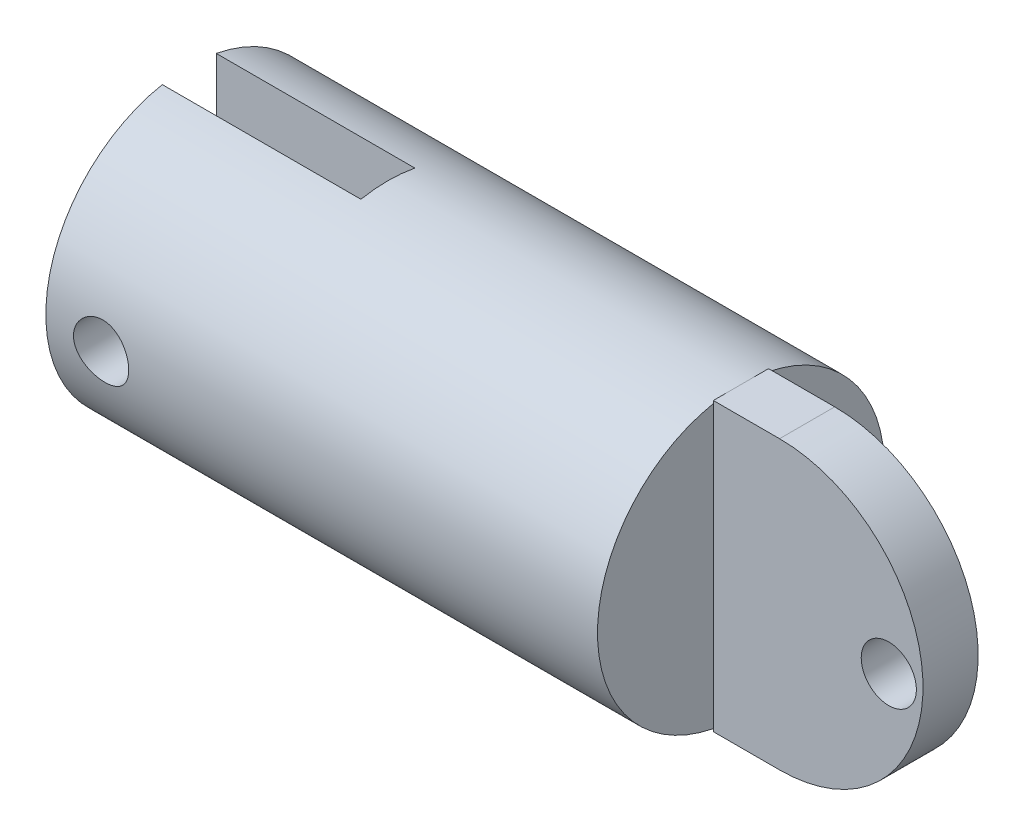
ISO-10303-21;
HEADER;
FILE_DESCRIPTION(('STEP AP214'),'2;1');
FILE_NAME('part.step','',(''),(''),'','','');
FILE_SCHEMA(('AUTOMOTIVE_DESIGN { 1 0 10303 214 1 1 1 1 }'));
ENDSEC;
DATA;
#1=APPLICATION_CONTEXT('core data for automotive mechanical design processes');
#2=APPLICATION_PROTOCOL_DEFINITION('international standard','automotive_design',2000,#1);
#3=PRODUCT_CONTEXT('',#1,'mechanical');
#4=PRODUCT('Part','Part','',(#3));
#5=PRODUCT_RELATED_PRODUCT_CATEGORY('part','',(#4));
#6=PRODUCT_DEFINITION_FORMATION('','',#4);
#7=PRODUCT_DEFINITION_CONTEXT('part definition',#1,'design');
#8=PRODUCT_DEFINITION('design','',#6,#7);
#9=PRODUCT_DEFINITION_SHAPE('','',#8);
#10=(LENGTH_UNIT() NAMED_UNIT(*) SI_UNIT(.MILLI.,.METRE.));
#11=(NAMED_UNIT(*) PLANE_ANGLE_UNIT() SI_UNIT($,.RADIAN.));
#12=(NAMED_UNIT(*) SI_UNIT($,.STERADIAN.) SOLID_ANGLE_UNIT());
#13=UNCERTAINTY_MEASURE_WITH_UNIT(LENGTH_MEASURE(1.E-05),#10,'distance_accuracy_value','');
#14=(GEOMETRIC_REPRESENTATION_CONTEXT(3) GLOBAL_UNCERTAINTY_ASSIGNED_CONTEXT((#13)) GLOBAL_UNIT_ASSIGNED_CONTEXT((#10,
#11,#12)) REPRESENTATION_CONTEXT('',''));
#15=CARTESIAN_POINT('',(0.,0.,0.));
#16=DIRECTION('',(0.,0.,1.));
#17=DIRECTION('',(1.,0.,0.));
#18=AXIS2_PLACEMENT_3D('',#15,#16,#17);
#19=CARTESIAN_POINT('',(-50.,0.,0.));
#20=DIRECTION('',(1.,0.,0.));
#21=DIRECTION('',(0.,0.,-1.));
#22=AXIS2_PLACEMENT_3D('',#19,#20,#21);
#23=PLANE('',#22);
#24=CARTESIAN_POINT('',(-50.,0.,0.));
#25=DIRECTION('',(1.,0.,0.));
#26=DIRECTION('',(0.,0.,-1.));
#27=AXIS2_PLACEMENT_3D('',#24,#25,#26);
#28=CIRCLE('',#27,13.);
#29=CARTESIAN_POINT('',(-50.,12.7676597025235,2.44680725038947));
#30=VERTEX_POINT('',#29);
#31=CARTESIAN_POINT('',(-50.,-12.7676597025235,2.44680725038947));
#32=VERTEX_POINT('',#31);
#33=EDGE_CURVE('E143',#30,#32,#28,.T.);
#34=ORIENTED_EDGE('',*,*,#33,.F.);
#35=DIRECTION('',(0.,-1.,0.));
#36=VECTOR('',#35,1.);
#37=CARTESIAN_POINT('',(-50.,0.,2.44680725038947));
#38=LINE('',#37,#36);
#39=EDGE_CURVE('E132',#30,#32,#38,.T.);
#40=ORIENTED_EDGE('',*,*,#39,.T.);
#41=EDGE_LOOP('',(#34,#40));
#42=FACE_BOUND('',#41,.T.);
#43=ADVANCED_FACE('F39',(#42),#23,.F.);
#44=CARTESIAN_POINT('',(0.,0.,0.));
#45=DIRECTION('',(1.,0.,0.));
#46=DIRECTION('',(0.,0.,-1.));
#47=AXIS2_PLACEMENT_3D('',#44,#45,#46);
#48=PLANE('',#47);
#49=DIRECTION('',(0.,1.,0.));
#50=VECTOR('',#49,1.);
#51=CARTESIAN_POINT('',(0.,13.,-2.5));
#52=LINE('',#51,#50);
#53=CARTESIAN_POINT('',(0.,-12.7573508221731,-2.5));
#54=VERTEX_POINT('',#53);
#55=CARTESIAN_POINT('',(0.,12.7573508221731,-2.5));
#56=VERTEX_POINT('',#55);
#57=EDGE_CURVE('E64',#54,#56,#52,.T.);
#58=ORIENTED_EDGE('',*,*,#57,.F.);
#59=CARTESIAN_POINT('',(0.,0.,0.));
#60=DIRECTION('',(1.,0.,0.));
#61=DIRECTION('',(0.,0.,-1.));
#62=AXIS2_PLACEMENT_3D('',#59,#60,#61);
#63=CIRCLE('',#62,13.);
#64=EDGE_CURVE('E153',#54,#56,#63,.T.);
#65=ORIENTED_EDGE('',*,*,#64,.T.);
#66=EDGE_LOOP('',(#58,#65));
#67=FACE_BOUND('',#66,.T.);
#68=ADVANCED_FACE('F301',(#67),#48,.T.);
#69=CARTESIAN_POINT('',(-50.,0.,0.));
#70=DIRECTION('',(1.,0.,0.));
#71=DIRECTION('',(0.,0.,-1.));
#72=AXIS2_PLACEMENT_3D('',#69,#70,#71);
#73=CYLINDRICAL_SURFACE('',#72,13.);
#74=CARTESIAN_POINT('',(-47.4494897427832,0.,-13.));
#75=CARTESIAN_POINT('',(-47.4215757491878,0.136723734169269,-12.9999978287144));
#76=CARTESIAN_POINT('',(-47.3821722131895,0.271172801388055,-12.9978220405805));
#77=CARTESIAN_POINT('',(-47.2815194665659,0.531597279639192,-12.9897819334407));
#78=CARTESIAN_POINT('',(-47.2202507637788,0.657565010318993,-12.9839143197066));
#79=CARTESIAN_POINT('',(-47.0777256657369,0.897312410511249,-12.9695508862574));
#80=CARTESIAN_POINT('',(-46.9964873679847,1.01110298232863,-12.9610574444205));
#81=CARTESIAN_POINT('',(-46.8162943510919,1.22350604535406,-12.9427361481948));
#82=CARTESIAN_POINT('',(-46.7173416022084,1.32212022226232,-12.9329084422365));
#83=CARTESIAN_POINT('',(-46.5034132377574,1.50237189031078,-12.913217871087));
#84=CARTESIAN_POINT('',(-46.3882962015134,1.5838416862168,-12.9033555390242));
#85=CARTESIAN_POINT('',(-46.1459296829617,1.72634382794069,-12.8850657365603));
#86=CARTESIAN_POINT('',(-46.018680051223,1.78737592199572,-12.8766382838353));
#87=CARTESIAN_POINT('',(-45.7555523430688,1.8872469945658,-12.8623816360036));
#88=CARTESIAN_POINT('',(-45.619671173171,1.92607796592346,-12.8565533785008));
#89=CARTESIAN_POINT('',(-45.3432158378982,1.98033096571072,-12.8483093774427));
#90=CARTESIAN_POINT('',(-45.2026420365422,1.99575480559667,-12.8458933698176));
#91=CARTESIAN_POINT('',(-44.9224175973916,2.00268118704075,-12.8448152549405));
#92=CARTESIAN_POINT('',(-44.7827734013928,1.99444045177645,-12.8461128603453));
#93=CARTESIAN_POINT('',(-44.5068836091346,1.95484362143187,-12.8521974995626));
#94=CARTESIAN_POINT('',(-44.3706379968808,1.92348763515794,-12.85698451695));
#95=CARTESIAN_POINT('',(-44.105614733407,1.8386751411561,-12.8693858314698));
#96=CARTESIAN_POINT('',(-43.9768245836373,1.78525691910775,-12.876995228468));
#97=CARTESIAN_POINT('',(-43.7299798216851,1.65785617477301,-12.8940150784186));
#98=CARTESIAN_POINT('',(-43.6119260165395,1.58387210827207,-12.9034256665995));
#99=CARTESIAN_POINT('',(-43.3885749196437,1.41650380841137,-12.9228738106549));
#100=CARTESIAN_POINT('',(-43.2834246776376,1.32292392354822,-12.9329169147347));
#101=CARTESIAN_POINT('',(-43.0902453128712,1.11941985101598,-12.9521165388722));
#102=CARTESIAN_POINT('',(-43.002216628952,1.00949524454407,-12.9612730362022));
#103=CARTESIAN_POINT('',(-42.8454934963779,0.775911192789316,-12.9773530620556));
#104=CARTESIAN_POINT('',(-42.7768679201938,0.652204941376102,-12.9842686487098));
#105=CARTESIAN_POINT('',(-42.6613954357001,0.394880496652117,-12.9946384125129));
#106=CARTESIAN_POINT('',(-42.6145465336526,0.261263212033667,-12.9980929065717));
#107=CARTESIAN_POINT('',(-42.5444549887853,-0.0103689129924156,-13.0006965824831));
#108=CARTESIAN_POINT('',(-42.5209379894465,-0.148312475231691,-12.9998965226881));
#109=CARTESIAN_POINT('',(-42.4972088157902,-0.426083546769016,-12.9937578800913));
#110=CARTESIAN_POINT('',(-42.4969951701566,-0.565910936569337,-12.9884195838441));
#111=CARTESIAN_POINT('',(-42.5196857600496,-0.842173025581212,-12.9734235887421));
#112=CARTESIAN_POINT('',(-42.54238447606,-0.978626835682899,-12.9638047147946));
#113=CARTESIAN_POINT('',(-42.6098170245559,-1.24564834168349,-12.9408782583401));
#114=CARTESIAN_POINT('',(-42.6545522770478,-1.37621565767232,-12.9275704381463));
#115=CARTESIAN_POINT('',(-42.7653040217404,-1.6293480846867,-12.8981258503603));
#116=CARTESIAN_POINT('',(-42.8315461390521,-1.75181100640934,-12.8819599565686));
#117=CARTESIAN_POINT('',(-42.9832911738149,-1.98395456899892,-12.8482568239927));
#118=CARTESIAN_POINT('',(-43.0687965775389,-2.09363355709463,-12.83071940838));
#119=CARTESIAN_POINT('',(-43.2585354648521,-2.29922902477439,-12.7954930043528));
#120=CARTESIAN_POINT('',(-43.3630850646312,-2.39485460623824,-12.7778071793235));
#121=CARTESIAN_POINT('',(-43.5870095656392,-2.56722530659596,-12.7442962400278));
#122=CARTESIAN_POINT('',(-43.7063845735272,-2.64397028964449,-12.7284711391498));
#123=CARTESIAN_POINT('',(-43.9565887426918,-2.77624535094376,-12.7002775986364));
#124=CARTESIAN_POINT('',(-44.0874056204613,-2.83179784510291,-12.6879055103895));
#125=CARTESIAN_POINT('',(-44.3568806007221,-2.92001808581307,-12.667894882041));
#126=CARTESIAN_POINT('',(-44.4955373280955,-2.95268983229654,-12.6602555146087));
#127=CARTESIAN_POINT('',(-44.7733322028811,-2.99356722109096,-12.6506517607422));
#128=CARTESIAN_POINT('',(-44.9123856823778,-3.00231912279706,-12.6485607003241));
#129=CARTESIAN_POINT('',(-45.1899827831136,-2.99663283714776,-12.6499091240791));
#130=CARTESIAN_POINT('',(-45.3285264464831,-2.98219661120546,-12.6533481404799));
#131=CARTESIAN_POINT('',(-45.599193786546,-2.93098348654871,-12.6653070700548));
#132=CARTESIAN_POINT('',(-45.7313796012316,-2.89451699497163,-12.6737563583719));
#133=CARTESIAN_POINT('',(-45.9877395573104,-2.80065385596611,-12.6948271456473));
#134=CARTESIAN_POINT('',(-46.1119130145834,-2.74325542407876,-12.7074490003105));
#135=CARTESIAN_POINT('',(-46.3507725311243,-2.60820226673847,-12.7358585885423));
#136=CARTESIAN_POINT('',(-46.4652900775253,-2.5302590523505,-12.7516906032536));
#137=CARTESIAN_POINT('',(-46.6797903877164,-2.35670234035246,-12.7849029117918));
#138=CARTESIAN_POINT('',(-46.7797714426918,-2.26108676829132,-12.8022833872589));
#139=CARTESIAN_POINT('',(-46.9647128459343,-2.05234756275481,-12.83741803321));
#140=CARTESIAN_POINT('',(-47.0492809168188,-1.93887590869561,-12.8551717350838));
#141=CARTESIAN_POINT('',(-47.1981961555738,-1.69910409862949,-12.889052888295));
#142=CARTESIAN_POINT('',(-47.2625397642053,-1.57280168974796,-12.9051800530445));
#143=CARTESIAN_POINT('',(-47.369145246575,-1.31067753812581,-12.9344319322278));
#144=CARTESIAN_POINT('',(-47.4113788590831,-1.1748438625545,-12.9475527919897));
#145=CARTESIAN_POINT('',(-47.4722208358458,-0.89774836263741,-12.9697071245566));
#146=CARTESIAN_POINT('',(-47.4908522642477,-0.756491976714164,-12.9787445821123));
#147=CARTESIAN_POINT('',(-47.5020959348899,-0.511790444375801,-12.990332076153));
#148=CARTESIAN_POINT('',(-47.5004525054817,-0.408624803445987,-12.9939825084367));
#149=CARTESIAN_POINT('',(-47.484458728668,-0.203225756657807,-12.998817242501));
#150=CARTESIAN_POINT('',(-47.4701086881602,-0.100992328344326,-13.0000016038414));
#151=CARTESIAN_POINT('',(-47.4494897427832,0.,-13.));
#152=B_SPLINE_CURVE_WITH_KNOTS('',3,(#74,#75,#76,#77,#78,#79,#80,#81,#82,#83,#84,#85,#86,#87,
#88,#89,#90,#91,#92,#93,#94,#95,#96,#97,#98,#99,#100,#101,#102,#103,#104,#105,#106,#107,#108,
#109,#110,#111,#112,#113,#114,#115,#116,#117,#118,#119,#120,#121,#122,#123,#124,#125,#126,#127,
#128,#129,#130,#131,#132,#133,#134,#135,#136,#137,#138,#139,#140,#141,#142,#143,#144,#145,#146,
#147,#148,#149,#150,#151),.UNSPECIFIED.,.T.,.F.,(4,2,2,2,2,2,2,2,2,2,2,2,2,2,2,2,2,2,2,2,2,2,2,
2,2,2,2,2,2,2,2,2,2,2,2,2,2,2,4),(0.,0.418254058881478,0.836881914371461,1.25513177687639,
1.67333514918743,2.09545632441491,2.51758269937153,2.93986122445226,3.36210706812016,
3.7797895742875,4.19747011438402,4.61442885831057,5.0314189186151,5.45278986290214,
5.87417160588972,6.29703081021796,6.71985129254079,7.13763877658911,7.55539988255132,
7.96944675904331,8.38352031967888,8.80208637469436,9.22070648415175,9.64704178540398,
10.0733801540361,10.4992663135907,10.9250780026157,11.3410807729439,11.7570483567175,
12.1672873574572,12.5775613394665,12.9939354234904,13.4103584142239,13.8362296953707,
14.262175882348,14.688665197043,15.1147374223941,15.4236923504943,15.7326398167302),.UNSPECIFIED.);
#153=CARTESIAN_POINT('',(-47.4494897427832,0.,-13.));
#154=VERTEX_POINT('',#153);
#155=EDGE_CURVE('E175',#154,#154,#152,.T.);
#156=ORIENTED_EDGE('',*,*,#155,.F.);
#157=EDGE_LOOP('',(#156));
#158=FACE_BOUND('',#157,.T.);
#159=CARTESIAN_POINT('',(-42.5,-0.499999999999999,12.9903810567666));
#160=CARTESIAN_POINT('',(-42.5000049901665,-0.361501153507956,12.995709489822));
#161=CARTESIAN_POINT('',(-42.5115473353782,-0.222852975702782,12.9988076587872));
#162=CARTESIAN_POINT('',(-42.5574635488008,0.0507094682017111,13.000622463334));
#163=CARTESIAN_POINT('',(-42.5918543573622,0.185620886416936,12.9993358450133));
#164=CARTESIAN_POINT('',(-42.6824458827128,0.447707553908392,12.992949454382));
#165=CARTESIAN_POINT('',(-42.7386312341574,0.574888180554902,12.9878523661439));
#166=CARTESIAN_POINT('',(-42.8711813803096,0.818071225564399,12.974806667389));
#167=CARTESIAN_POINT('',(-42.9475448009956,0.934074404319833,12.9668582510196));
#168=CARTESIAN_POINT('',(-43.1190201177789,1.15268599188761,12.9492647647196));
#169=CARTESIAN_POINT('',(-43.214280874428,1.25517653815447,12.9396062936089));
#170=CARTESIAN_POINT('',(-43.4205265635236,1.44286064671827,12.9200262514374));
#171=CARTESIAN_POINT('',(-43.5315126763608,1.52805290938693,12.9101046606717));
#172=CARTESIAN_POINT('',(-43.7673907340223,1.67956864714027,12.8912744686344));
#173=CARTESIAN_POINT('',(-43.8924124990012,1.74569163279603,12.8823771828217));
#174=CARTESIAN_POINT('',(-44.1519292967569,1.85598208319276,12.8669518660722));
#175=CARTESIAN_POINT('',(-44.2864238810125,1.90015058664262,12.8604237230506));
#176=CARTESIAN_POINT('',(-44.5602485628573,1.96501500521998,12.8506730029179));
#177=CARTESIAN_POINT('',(-44.6995458789945,1.98584633271909,12.8474313666173));
#178=CARTESIAN_POINT('',(-44.9796934210514,2.0038543169856,12.8446352839922));
#179=CARTESIAN_POINT('',(-45.1205435465131,2.00103249511444,12.8450806005243));
#180=CARTESIAN_POINT('',(-45.3983836119073,1.97196623168534,12.84957412172));
#181=CARTESIAN_POINT('',(-45.5353975208894,1.94594473850674,12.8535880312482));
#182=CARTESIAN_POINT('',(-45.8030942711128,1.87156911439447,12.8646270704002));
#183=CARTESIAN_POINT('',(-45.9337768782719,1.82321415843823,12.8716523112651));
#184=CARTESIAN_POINT('',(-46.1857475192197,1.70531945545675,12.8878013018127));
#185=CARTESIAN_POINT('',(-46.3069929376613,1.63568989826599,12.8969339068798));
#186=CARTESIAN_POINT('',(-46.5361718970029,1.47726691202496,12.9160376366422));
#187=CARTESIAN_POINT('',(-46.6441044631573,1.38847208103173,12.9260088226473));
#188=CARTESIAN_POINT('',(-46.8447590555712,1.19312440476227,12.9455075639022));
#189=CARTESIAN_POINT('',(-46.9373120064907,1.08639719908478,12.9550294562959));
#190=CARTESIAN_POINT('',(-47.1032150270281,0.858792317990704,12.9721037780524));
#191=CARTESIAN_POINT('',(-47.1765655494936,0.737914976371717,12.9796562538596));
#192=CARTESIAN_POINT('',(-47.3017307722344,0.485789647175781,12.9915306127603));
#193=CARTESIAN_POINT('',(-47.3536107856233,0.354574578484824,12.9958623258992));
#194=CARTESIAN_POINT('',(-47.4345995107805,0.0852317134487092,13.0004176086048));
#195=CARTESIAN_POINT('',(-47.4637105755035,-0.05289536703559,13.000641602719));
#196=CARTESIAN_POINT('',(-47.4980721859513,-0.330083150262153,12.9965376895566));
#197=CARTESIAN_POINT('',(-47.5036454585757,-0.469104870552478,12.9922723578635));
#198=CARTESIAN_POINT('',(-47.4917278944101,-0.745941785581634,12.9793210014869));
#199=CARTESIAN_POINT('',(-47.4742374087623,-0.883756998657196,12.9706350441081));
#200=CARTESIAN_POINT('',(-47.4168737657643,-1.15404430097119,12.9493835879121));
#201=CARTESIAN_POINT('',(-47.3770437507406,-1.28652616307439,12.9368255878079));
#202=CARTESIAN_POINT('',(-47.276269699902,-1.54286552029207,12.9087648041395));
#203=CARTESIAN_POINT('',(-47.215323480111,-1.66672212173362,12.8932617160499));
#204=CARTESIAN_POINT('',(-47.0728565699667,-1.90456494125662,12.8602994590594));
#205=CARTESIAN_POINT('',(-46.9910080227116,-2.01835082837527,12.8428118495204));
#206=CARTESIAN_POINT('',(-46.8094966813075,-2.23067425548268,12.8076420615884));
#207=CARTESIAN_POINT('',(-46.7098319453794,-2.32921013119275,12.7899598621844));
#208=CARTESIAN_POINT('',(-46.4938361404859,-2.50960665871404,12.755800141826));
#209=CARTESIAN_POINT('',(-46.3772958160442,-2.59122087614422,12.739342399248));
#210=CARTESIAN_POINT('',(-46.1317690483093,-2.73365987449571,12.7095405822549));
#211=CARTESIAN_POINT('',(-46.0027836071379,-2.79448632752784,12.6961962574323));
#212=CARTESIAN_POINT('',(-45.7375461399028,-2.89286421621736,12.6741416143916));
#213=CARTESIAN_POINT('',(-45.6013953452496,-2.93067656746814,12.6653795133037));
#214=CARTESIAN_POINT('',(-45.3244475281615,-2.98285729080281,12.6531930644553));
#215=CARTESIAN_POINT('',(-45.1836513034867,-2.99722966707599,12.6497678050206));
#216=CARTESIAN_POINT('',(-44.9049965479795,-3.0019855323756,12.6486396001095));
#217=CARTESIAN_POINT('',(-44.767147841806,-2.99293174870353,12.6508024197776));
#218=CARTESIAN_POINT('',(-44.4949978296039,-2.95232567531508,12.6603396764292));
#219=CARTESIAN_POINT('',(-44.3606964769878,-2.92077368122175,12.6677140449338));
#220=CARTESIAN_POINT('',(-44.0997590837975,-2.8363055742919,12.6868918197981));
#221=CARTESIAN_POINT('',(-43.9731026982722,-2.78344932586259,12.6986828090596));
#222=CARTESIAN_POINT('',(-43.7303879277437,-2.6579518827983,12.7255409333583));
#223=CARTESIAN_POINT('',(-43.6143306233446,-2.58530867383089,12.7406084019128));
#224=CARTESIAN_POINT('',(-43.3933650321004,-2.42045262795396,12.7729635991746));
#225=CARTESIAN_POINT('',(-43.2887564834926,-2.32784614493661,12.79029271666));
#226=CARTESIAN_POINT('',(-43.0963885786881,-2.1265458102858,12.8252961365836));
#227=CARTESIAN_POINT('',(-43.0086338303597,-2.01784757347285,12.8429705319705));
#228=CARTESIAN_POINT('',(-42.8510096083454,-1.78526734661709,12.8773778398915));
#229=CARTESIAN_POINT('',(-42.7814706829718,-1.66115802083913,12.89408955521));
#230=CARTESIAN_POINT('',(-42.6643730168269,-1.40273646369133,12.9247514471685));
#231=CARTESIAN_POINT('',(-42.6167948112053,-1.26843339097821,12.9387040630371));
#232=CARTESIAN_POINT('',(-42.5541344313254,-1.02823582064285,12.9596838876837));
#233=CARTESIAN_POINT('',(-42.5338794365028,-0.923735386609171,12.9675701811188));
#234=CARTESIAN_POINT('',(-42.5068105664024,-0.712852669200175,12.9808706108813));
#235=CARTESIAN_POINT('',(-42.4999961638286,-0.606470459815142,12.9862848441852));
#236=CARTESIAN_POINT('',(-42.5,-0.499999999999999,12.9903810567666));
#237=B_SPLINE_CURVE_WITH_KNOTS('',3,(#159,#160,#161,#162,#163,#164,#165,#166,#167,#168,#169,
#170,#171,#172,#173,#174,#175,#176,#177,#178,#179,#180,#181,#182,#183,#184,#185,#186,#187,#188,
#189,#190,#191,#192,#193,#194,#195,#196,#197,#198,#199,#200,#201,#202,#203,#204,#205,#206,#207,
#208,#209,#210,#211,#212,#213,#214,#215,#216,#217,#218,#219,#220,#221,#222,#223,#224,#225,#226,
#227,#228,#229,#230,#231,#232,#233,#234,#235,#236),.UNSPECIFIED.,.T.,.F.,(4,2,2,2,2,2,2,2,2,2,2,
2,2,2,2,2,2,2,2,2,2,2,2,2,2,2,2,2,2,2,2,2,2,2,2,2,2,2,4),(0.,0.415417551312908,
0.831143446512928,1.24657678242787,1.66198183677677,2.08079933216553,2.499648281879,
2.92275250359763,3.34583670553406,3.76645306564735,4.1870423720861,4.6036328764085,
5.02023877127093,5.43862824170088,5.85704832776907,6.27980108233956,6.70254386630459,
7.12399104608537,7.54539466754391,7.96100127410616,8.37660155319457,8.79140197075699,
9.20624530250857,9.62804473112866,10.0498901595528,10.4775037564783,10.9050829492378,
11.3277196227344,11.7502840907539,12.1627927415707,12.5752959721867,12.9866480715185,
13.3980420625673,13.8184433645562,14.2389594421232,14.6666472091871,15.0939551644479,
15.4133183514239,15.7326690090202),.UNSPECIFIED.);
#238=CARTESIAN_POINT('',(-42.5,-0.499999999999999,12.9903810567666));
#239=VERTEX_POINT('',#238);
#240=EDGE_CURVE('E322',#239,#239,#237,.T.);
#241=ORIENTED_EDGE('',*,*,#240,.F.);
#242=EDGE_LOOP('',(#241));
#243=FACE_BOUND('',#242,.T.);
#244=DIRECTION('',(1.,0.,0.));
#245=VECTOR('',#244,1.);
#246=CARTESIAN_POINT('',(-50.,-12.7676597025235,2.44680725038947));
#247=LINE('',#246,#245);
#248=CARTESIAN_POINT('',(-32.,-12.7676597025235,2.44680725038947));
#249=VERTEX_POINT('',#248);
#250=EDGE_CURVE('E162',#249,#32,#247,.F.);
#251=ORIENTED_EDGE('',*,*,#250,.F.);
#252=CARTESIAN_POINT('',(-32.,0.,0.));
#253=DIRECTION('',(1.,0.,0.));
#254=DIRECTION('',(0.,0.,-1.));
#255=AXIS2_PLACEMENT_3D('',#252,#253,#254);
#256=CIRCLE('',#255,13.);
#257=CARTESIAN_POINT('',(-32.,-12.7676597025235,-2.44680725038947));
#258=VERTEX_POINT('',#257);
#259=EDGE_CURVE('E11',#258,#249,#256,.F.);
#260=ORIENTED_EDGE('',*,*,#259,.F.);
#261=DIRECTION('',(1.,0.,0.));
#262=VECTOR('',#261,1.);
#263=CARTESIAN_POINT('',(-50.,-12.7676597025235,-2.44680725038947));
#264=LINE('',#263,#262);
#265=CARTESIAN_POINT('',(-50.,-12.7676597025235,-2.44680725038947));
#266=VERTEX_POINT('',#265);
#267=EDGE_CURVE('E126',#266,#258,#264,.T.);
#268=ORIENTED_EDGE('',*,*,#267,.F.);
#269=CARTESIAN_POINT('',(-50.,12.7676597025235,-2.44680725038947));
#270=VERTEX_POINT('',#269);
#271=EDGE_CURVE('E137',#266,#270,#28,.T.);
#272=ORIENTED_EDGE('',*,*,#271,.T.);
#273=DIRECTION('',(1.,0.,0.));
#274=VECTOR('',#273,1.);
#275=CARTESIAN_POINT('',(-50.,12.7676597025235,-2.44680725038947));
#276=LINE('',#275,#274);
#277=CARTESIAN_POINT('',(-32.,12.7676597025235,-2.44680725038947));
#278=VERTEX_POINT('',#277);
#279=EDGE_CURVE('E57',#278,#270,#276,.F.);
#280=ORIENTED_EDGE('',*,*,#279,.F.);
#281=CARTESIAN_POINT('',(-32.,12.7676597025235,2.44680725038947));
#282=VERTEX_POINT('',#281);
#283=EDGE_CURVE('E50',#282,#278,#256,.F.);
#284=ORIENTED_EDGE('',*,*,#283,.F.);
#285=DIRECTION('',(1.,0.,0.));
#286=VECTOR('',#285,1.);
#287=CARTESIAN_POINT('',(-50.,12.7676597025235,2.44680725038947));
#288=LINE('',#287,#286);
#289=EDGE_CURVE('E178',#30,#282,#288,.T.);
#290=ORIENTED_EDGE('',*,*,#289,.F.);
#291=ORIENTED_EDGE('',*,*,#33,.T.);
#292=EDGE_LOOP('',(#251,#260,#268,#272,#280,#284,#290,#291));
#293=FACE_BOUND('',#292,.T.);
#294=CARTESIAN_POINT('',(0.,13.,0.));
#295=VERTEX_POINT('',#294);
#296=EDGE_CURVE('E144',#56,#295,#63,.T.);
#297=ORIENTED_EDGE('',*,*,#296,.F.);
#298=ORIENTED_EDGE('',*,*,#64,.F.);
#299=CARTESIAN_POINT('',(0.,-13.,0.));
#300=VERTEX_POINT('',#299);
#301=EDGE_CURVE('E242',#300,#54,#63,.T.);
#302=ORIENTED_EDGE('',*,*,#301,.F.);
#303=CARTESIAN_POINT('',(0.,-12.7573508221731,2.5));
#304=VERTEX_POINT('',#303);
#305=EDGE_CURVE('E246',#304,#300,#63,.T.);
#306=ORIENTED_EDGE('',*,*,#305,.F.);
#307=CARTESIAN_POINT('',(0.,12.7573508221731,2.5));
#308=VERTEX_POINT('',#307);
#309=EDGE_CURVE('E252',#308,#304,#63,.T.);
#310=ORIENTED_EDGE('',*,*,#309,.F.);
#311=EDGE_CURVE('E151',#295,#308,#63,.T.);
#312=ORIENTED_EDGE('',*,*,#311,.F.);
#313=EDGE_LOOP('',(#297,#298,#302,#306,#310,#312));
#314=FACE_BOUND('',#313,.T.);
#315=ADVANCED_FACE('F41',(#158,#243,#293,#314),#73,.T.);
#316=ORIENTED_EDGE('',*,*,#271,.F.);
#317=DIRECTION('',(0.,1.,0.));
#318=VECTOR('',#317,1.);
#319=CARTESIAN_POINT('',(-50.,0.,-2.44680725038947));
#320=LINE('',#319,#318);
#321=EDGE_CURVE('E123',#266,#270,#320,.T.);
#322=ORIENTED_EDGE('',*,*,#321,.T.);
#323=EDGE_LOOP('',(#316,#322));
#324=FACE_BOUND('',#323,.T.);
#325=ADVANCED_FACE('F141',(#324),#23,.F.);
#326=DIRECTION('',(0.,-1.,0.));
#327=VECTOR('',#326,1.);
#328=CARTESIAN_POINT('',(0.,13.,2.5));
#329=LINE('',#328,#327);
#330=EDGE_CURVE('E149',#308,#304,#329,.T.);
#331=ORIENTED_EDGE('',*,*,#330,.F.);
#332=ORIENTED_EDGE('',*,*,#309,.T.);
#333=EDGE_LOOP('',(#331,#332));
#334=FACE_BOUND('',#333,.T.);
#335=ADVANCED_FACE('F298',(#334),#48,.T.);
#336=CARTESIAN_POINT('',(0.,0.,0.));
#337=DIRECTION('',(-1.,0.,0.));
#338=DIRECTION('',(0.,0.,1.));
#339=AXIS2_PLACEMENT_3D('',#336,#337,#338);
#340=PLANE('',#339);
#341=CARTESIAN_POINT('',(0.,13.,-2.5));
#342=VERTEX_POINT('',#341);
#343=EDGE_CURVE('E222',#56,#342,#52,.T.);
#344=ORIENTED_EDGE('',*,*,#343,.F.);
#345=ORIENTED_EDGE('',*,*,#296,.T.);
#346=DIRECTION('',(0.,0.,1.));
#347=VECTOR('',#346,1.);
#348=CARTESIAN_POINT('',(0.,13.,2.5));
#349=LINE('',#348,#347);
#350=EDGE_CURVE('E208',#342,#295,#349,.T.);
#351=ORIENTED_EDGE('',*,*,#350,.F.);
#352=EDGE_LOOP('',(#344,#345,#351));
#353=FACE_BOUND('',#352,.T.);
#354=ADVANCED_FACE('F278',(#353),#340,.T.);
#355=CARTESIAN_POINT('',(0.,13.,2.5));
#356=VERTEX_POINT('',#355);
#357=EDGE_CURVE('E194',#295,#356,#349,.T.);
#358=ORIENTED_EDGE('',*,*,#357,.F.);
#359=ORIENTED_EDGE('',*,*,#311,.T.);
#360=EDGE_CURVE('E213',#356,#308,#329,.T.);
#361=ORIENTED_EDGE('',*,*,#360,.F.);
#362=EDGE_LOOP('',(#358,#359,#361));
#363=FACE_BOUND('',#362,.T.);
#364=ADVANCED_FACE('F264',(#363),#340,.T.);
#365=CARTESIAN_POINT('',(0.,-13.,2.5));
#366=VERTEX_POINT('',#365);
#367=EDGE_CURVE('E212',#304,#366,#329,.T.);
#368=ORIENTED_EDGE('',*,*,#367,.F.);
#369=ORIENTED_EDGE('',*,*,#305,.T.);
#370=DIRECTION('',(0.,0.,-1.));
#371=VECTOR('',#370,1.);
#372=CARTESIAN_POINT('',(0.,-13.,2.5));
#373=LINE('',#372,#371);
#374=EDGE_CURVE('E218',#366,#300,#373,.T.);
#375=ORIENTED_EDGE('',*,*,#374,.F.);
#376=EDGE_LOOP('',(#368,#369,#375));
#377=FACE_BOUND('',#376,.T.);
#378=ADVANCED_FACE('F279',(#377),#340,.T.);
#379=CARTESIAN_POINT('',(6.,13.,2.5));
#380=DIRECTION('',(0.,-1.,0.));
#381=DIRECTION('',(0.,0.,-1.));
#382=AXIS2_PLACEMENT_3D('',#379,#380,#381);
#383=PLANE('',#382);
#384=ORIENTED_EDGE('',*,*,#350,.T.);
#385=ORIENTED_EDGE('',*,*,#357,.T.);
#386=DIRECTION('',(-1.,0.,0.));
#387=VECTOR('',#386,1.);
#388=CARTESIAN_POINT('',(6.,13.,2.5));
#389=LINE('',#388,#387);
#390=CARTESIAN_POINT('',(6.,13.,2.5));
#391=VERTEX_POINT('',#390);
#392=EDGE_CURVE('E155',#391,#356,#389,.T.);
#393=ORIENTED_EDGE('',*,*,#392,.F.);
#394=DIRECTION('',(0.,0.,1.));
#395=VECTOR('',#394,1.);
#396=CARTESIAN_POINT('',(6.,13.,2.5));
#397=LINE('',#396,#395);
#398=CARTESIAN_POINT('',(6.,13.,-2.5));
#399=VERTEX_POINT('',#398);
#400=EDGE_CURVE('E198',#399,#391,#397,.T.);
#401=ORIENTED_EDGE('',*,*,#400,.F.);
#402=DIRECTION('',(-1.,0.,0.));
#403=VECTOR('',#402,1.);
#404=CARTESIAN_POINT('',(6.,13.,-2.5));
#405=LINE('',#404,#403);
#406=EDGE_CURVE('E207',#399,#342,#405,.T.);
#407=ORIENTED_EDGE('',*,*,#406,.T.);
#408=EDGE_LOOP('',(#384,#385,#393,#401,#407));
#409=FACE_BOUND('',#408,.T.);
#410=ADVANCED_FACE('F273',(#409),#383,.F.);
#411=CARTESIAN_POINT('',(6.,13.,2.5));
#412=DIRECTION('',(0.,0.,-1.));
#413=DIRECTION('',(-1.,0.,0.));
#414=AXIS2_PLACEMENT_3D('',#411,#412,#413);
#415=PLANE('',#414);
#416=CARTESIAN_POINT('',(15.9,-0.499999999999995,2.5));
#417=DIRECTION('',(0.,0.,-1.));
#418=DIRECTION('',(-1.,0.,0.));
#419=AXIS2_PLACEMENT_3D('',#416,#417,#418);
#420=CIRCLE('',#419,2.5);
#421=CARTESIAN_POINT('',(13.4,-0.499999999999995,2.5));
#422=VERTEX_POINT('',#421);
#423=EDGE_CURVE('E161',#422,#422,#420,.T.);
#424=ORIENTED_EDGE('',*,*,#423,.T.);
#425=EDGE_LOOP('',(#424));
#426=FACE_BOUND('',#425,.T.);
#427=ORIENTED_EDGE('',*,*,#360,.T.);
#428=ORIENTED_EDGE('',*,*,#330,.T.);
#429=ORIENTED_EDGE('',*,*,#367,.T.);
#430=DIRECTION('',(-1.,0.,0.));
#431=VECTOR('',#430,1.);
#432=CARTESIAN_POINT('',(6.,-13.,2.5));
#433=LINE('',#432,#431);
#434=CARTESIAN_POINT('',(6.,-13.,2.5));
#435=VERTEX_POINT('',#434);
#436=EDGE_CURVE('E232',#435,#366,#433,.T.);
#437=ORIENTED_EDGE('',*,*,#436,.F.);
#438=CARTESIAN_POINT('',(6.,0.,2.5));
#439=DIRECTION('',(0.,0.,1.));
#440=DIRECTION('',(1.,0.,0.));
#441=AXIS2_PLACEMENT_3D('',#438,#439,#440);
#442=CIRCLE('',#441,13.);
#443=EDGE_CURVE('E189',#435,#391,#442,.T.);
#444=ORIENTED_EDGE('',*,*,#443,.T.);
#445=ORIENTED_EDGE('',*,*,#392,.T.);
#446=EDGE_LOOP('',(#427,#428,#429,#437,#444,#445));
#447=FACE_BOUND('',#446,.T.);
#448=ADVANCED_FACE('F266',(#426,#447),#415,.F.);
#449=CARTESIAN_POINT('',(6.,-13.,2.5));
#450=DIRECTION('',(0.,1.,0.));
#451=DIRECTION('',(0.,0.,1.));
#452=AXIS2_PLACEMENT_3D('',#449,#450,#451);
#453=PLANE('',#452);
#454=ORIENTED_EDGE('',*,*,#374,.T.);
#455=CARTESIAN_POINT('',(0.,-13.,-2.5));
#456=VERTEX_POINT('',#455);
#457=EDGE_CURVE('E217',#300,#456,#373,.T.);
#458=ORIENTED_EDGE('',*,*,#457,.T.);
#459=DIRECTION('',(-1.,0.,0.));
#460=VECTOR('',#459,1.);
#461=CARTESIAN_POINT('',(6.,-13.,-2.5));
#462=LINE('',#461,#460);
#463=CARTESIAN_POINT('',(6.,-13.,-2.5));
#464=VERTEX_POINT('',#463);
#465=EDGE_CURVE('E229',#464,#456,#462,.T.);
#466=ORIENTED_EDGE('',*,*,#465,.F.);
#467=DIRECTION('',(0.,0.,-1.));
#468=VECTOR('',#467,1.);
#469=CARTESIAN_POINT('',(6.,-13.,2.5));
#470=LINE('',#469,#468);
#471=EDGE_CURVE('E202',#435,#464,#470,.T.);
#472=ORIENTED_EDGE('',*,*,#471,.F.);
#473=ORIENTED_EDGE('',*,*,#436,.T.);
#474=EDGE_LOOP('',(#454,#458,#466,#472,#473));
#475=FACE_BOUND('',#474,.T.);
#476=ADVANCED_FACE('F280',(#475),#453,.F.);
#477=CARTESIAN_POINT('',(6.,13.,-2.5));
#478=DIRECTION('',(0.,0.,1.));
#479=DIRECTION('',(1.,0.,0.));
#480=AXIS2_PLACEMENT_3D('',#477,#478,#479);
#481=PLANE('',#480);
#482=CARTESIAN_POINT('',(15.9,-0.499999999999995,-2.5));
#483=DIRECTION('',(0.,0.,1.));
#484=DIRECTION('',(1.,0.,0.));
#485=AXIS2_PLACEMENT_3D('',#482,#483,#484);
#486=CIRCLE('',#485,2.5);
#487=CARTESIAN_POINT('',(18.4,-0.499999999999995,-2.5));
#488=VERTEX_POINT('',#487);
#489=EDGE_CURVE('E158',#488,#488,#486,.T.);
#490=ORIENTED_EDGE('',*,*,#489,.T.);
#491=EDGE_LOOP('',(#490));
#492=FACE_BOUND('',#491,.T.);
#493=EDGE_CURVE('E203',#456,#54,#52,.T.);
#494=ORIENTED_EDGE('',*,*,#493,.T.);
#495=ORIENTED_EDGE('',*,*,#57,.T.);
#496=ORIENTED_EDGE('',*,*,#343,.T.);
#497=ORIENTED_EDGE('',*,*,#406,.F.);
#498=CARTESIAN_POINT('',(6.,0.,-2.5));
#499=DIRECTION('',(0.,0.,1.));
#500=DIRECTION('',(1.,0.,0.));
#501=AXIS2_PLACEMENT_3D('',#498,#499,#500);
#502=CIRCLE('',#501,13.);
#503=EDGE_CURVE('E190',#464,#399,#502,.T.);
#504=ORIENTED_EDGE('',*,*,#503,.F.);
#505=ORIENTED_EDGE('',*,*,#465,.T.);
#506=EDGE_LOOP('',(#494,#495,#496,#497,#504,#505));
#507=FACE_BOUND('',#506,.T.);
#508=ADVANCED_FACE('F283',(#492,#507),#481,.F.);
#509=ORIENTED_EDGE('',*,*,#457,.F.);
#510=ORIENTED_EDGE('',*,*,#301,.T.);
#511=ORIENTED_EDGE('',*,*,#493,.F.);
#512=EDGE_LOOP('',(#509,#510,#511));
#513=FACE_BOUND('',#512,.T.);
#514=ADVANCED_FACE('F284',(#513),#340,.T.);
#515=CARTESIAN_POINT('',(6.,0.,-2.5));
#516=DIRECTION('',(0.,0.,1.));
#517=DIRECTION('',(1.,0.,0.));
#518=AXIS2_PLACEMENT_3D('',#515,#516,#517);
#519=CYLINDRICAL_SURFACE('',#518,13.);
#520=ORIENTED_EDGE('',*,*,#443,.F.);
#521=ORIENTED_EDGE('',*,*,#471,.T.);
#522=ORIENTED_EDGE('',*,*,#503,.T.);
#523=ORIENTED_EDGE('',*,*,#400,.T.);
#524=EDGE_LOOP('',(#520,#521,#522,#523));
#525=FACE_BOUND('',#524,.T.);
#526=ADVANCED_FACE('F286',(#525),#519,.T.);
#527=CARTESIAN_POINT('',(15.9,-0.499999999999995,-13.));
#528=DIRECTION('',(0.,0.,1.));
#529=DIRECTION('',(1.,0.,0.));
#530=AXIS2_PLACEMENT_3D('',#527,#528,#529);
#531=CYLINDRICAL_SURFACE('',#530,2.5);
#532=ORIENTED_EDGE('',*,*,#489,.F.);
#533=EDGE_LOOP('',(#532));
#534=FACE_BOUND('',#533,.T.);
#535=ORIENTED_EDGE('',*,*,#423,.F.);
#536=EDGE_LOOP('',(#535));
#537=FACE_BOUND('',#536,.T.);
#538=ADVANCED_FACE('F292',(#534,#537),#531,.F.);
#539=CARTESIAN_POINT('',(-32.,13.,2.44680725038947));
#540=DIRECTION('',(0.,0.,1.));
#541=DIRECTION('',(1.,0.,0.));
#542=AXIS2_PLACEMENT_3D('',#539,#540,#541);
#543=PLANE('',#542);
#544=CARTESIAN_POINT('',(-45.,-0.499999999999999,2.44680725038947));
#545=DIRECTION('',(0.,0.,1.));
#546=DIRECTION('',(1.,0.,0.));
#547=AXIS2_PLACEMENT_3D('',#544,#545,#546);
#548=CIRCLE('',#547,2.5);
#549=CARTESIAN_POINT('',(-42.5,-0.499999999999999,2.44680725038947));
#550=VERTEX_POINT('',#549);
#551=EDGE_CURVE('E325',#550,#550,#548,.T.);
#552=ORIENTED_EDGE('',*,*,#551,.T.);
#553=EDGE_LOOP('',(#552));
#554=FACE_BOUND('',#553,.T.);
#555=ORIENTED_EDGE('',*,*,#250,.T.);
#556=ORIENTED_EDGE('',*,*,#39,.F.);
#557=ORIENTED_EDGE('',*,*,#289,.T.);
#558=DIRECTION('',(0.,1.,0.));
#559=VECTOR('',#558,1.);
#560=CARTESIAN_POINT('',(-32.,13.,2.44680725038947));
#561=LINE('',#560,#559);
#562=EDGE_CURVE('E139',#249,#282,#561,.T.);
#563=ORIENTED_EDGE('',*,*,#562,.F.);
#564=EDGE_LOOP('',(#555,#556,#557,#563));
#565=FACE_BOUND('',#564,.T.);
#566=ADVANCED_FACE('F347',(#554,#565),#543,.F.);
#567=CARTESIAN_POINT('',(-32.,13.,-2.44680725038947));
#568=DIRECTION('',(0.,0.,-1.));
#569=DIRECTION('',(-1.,0.,0.));
#570=AXIS2_PLACEMENT_3D('',#567,#568,#569);
#571=PLANE('',#570);
#572=CARTESIAN_POINT('',(-45.,-0.499999999999999,-2.44680725038948));
#573=DIRECTION('',(0.,0.,-1.));
#574=DIRECTION('',(-1.,0.,0.));
#575=AXIS2_PLACEMENT_3D('',#572,#573,#574);
#576=CIRCLE('',#575,2.5);
#577=CARTESIAN_POINT('',(-47.5,-0.499999999999999,-2.44680725038948));
#578=VERTEX_POINT('',#577);
#579=EDGE_CURVE('E44',#578,#578,#576,.T.);
#580=ORIENTED_EDGE('',*,*,#579,.T.);
#581=EDGE_LOOP('',(#580));
#582=FACE_BOUND('',#581,.T.);
#583=ORIENTED_EDGE('',*,*,#279,.T.);
#584=ORIENTED_EDGE('',*,*,#321,.F.);
#585=ORIENTED_EDGE('',*,*,#267,.T.);
#586=DIRECTION('',(0.,-1.,0.));
#587=VECTOR('',#586,1.);
#588=CARTESIAN_POINT('',(-32.,13.,-2.44680725038947));
#589=LINE('',#588,#587);
#590=EDGE_CURVE('E170',#278,#258,#589,.T.);
#591=ORIENTED_EDGE('',*,*,#590,.F.);
#592=EDGE_LOOP('',(#583,#584,#585,#591));
#593=FACE_BOUND('',#592,.T.);
#594=ADVANCED_FACE('F125',(#582,#593),#571,.F.);
#595=CARTESIAN_POINT('',(-32.,0.,0.));
#596=DIRECTION('',(1.,0.,0.));
#597=DIRECTION('',(0.,0.,-1.));
#598=AXIS2_PLACEMENT_3D('',#595,#596,#597);
#599=PLANE('',#598);
#600=ORIENTED_EDGE('',*,*,#590,.T.);
#601=ORIENTED_EDGE('',*,*,#259,.T.);
#602=ORIENTED_EDGE('',*,*,#562,.T.);
#603=ORIENTED_EDGE('',*,*,#283,.T.);
#604=EDGE_LOOP('',(#600,#601,#602,#603));
#605=FACE_BOUND('',#604,.T.);
#606=ADVANCED_FACE('F169',(#605),#599,.F.);
#607=CARTESIAN_POINT('',(-45.,-0.499999999999999,-13.));
#608=DIRECTION('',(0.,0.,1.));
#609=DIRECTION('',(1.,0.,0.));
#610=AXIS2_PLACEMENT_3D('',#607,#608,#609);
#611=CYLINDRICAL_SURFACE('',#610,2.5);
#612=ORIENTED_EDGE('',*,*,#155,.T.);
#613=EDGE_LOOP('',(#612));
#614=FACE_BOUND('',#613,.T.);
#615=ORIENTED_EDGE('',*,*,#579,.F.);
#616=EDGE_LOOP('',(#615));
#617=FACE_BOUND('',#616,.T.);
#618=ADVANCED_FACE('F343',(#614,#617),#611,.F.);
#619=ORIENTED_EDGE('',*,*,#240,.T.);
#620=EDGE_LOOP('',(#619));
#621=FACE_BOUND('',#620,.T.);
#622=ORIENTED_EDGE('',*,*,#551,.F.);
#623=EDGE_LOOP('',(#622));
#624=FACE_BOUND('',#623,.T.);
#625=ADVANCED_FACE('F339',(#621,#624),#611,.F.);
#626=CLOSED_SHELL('',(#43,#68,#315,#325,#335,#354,#364,#378,#410,#448,#476,#508,#514,#526,#538,
#566,#594,#606,#618,#625));
#627=MANIFOLD_SOLID_BREP('B2',#626);
#628=ADVANCED_BREP_SHAPE_REPRESENTATION('',(#18,#627),#14);
#629=SHAPE_DEFINITION_REPRESENTATION(#9,#628);
ENDSEC;
END-ISO-10303-21;
